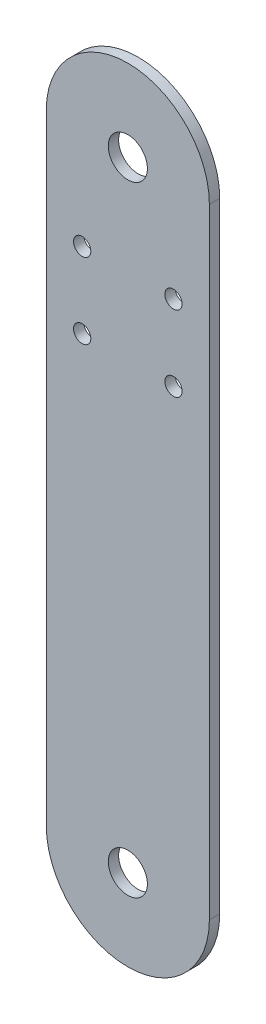
ISO-10303-21;
HEADER;
FILE_DESCRIPTION(('STEP AP214'),'2;1');
FILE_NAME('part.step','',(''),(''),'','','');
FILE_SCHEMA(('AUTOMOTIVE_DESIGN { 1 0 10303 214 1 1 1 1 }'));
ENDSEC;
DATA;
#1=APPLICATION_CONTEXT('core data for automotive mechanical design processes');
#2=APPLICATION_PROTOCOL_DEFINITION('international standard','automotive_design',2000,#1);
#3=PRODUCT_CONTEXT('',#1,'mechanical');
#4=PRODUCT('Part','Part','',(#3));
#5=PRODUCT_RELATED_PRODUCT_CATEGORY('part','',(#4));
#6=PRODUCT_DEFINITION_FORMATION('','',#4);
#7=PRODUCT_DEFINITION_CONTEXT('part definition',#1,'design');
#8=PRODUCT_DEFINITION('design','',#6,#7);
#9=PRODUCT_DEFINITION_SHAPE('','',#8);
#10=(LENGTH_UNIT() NAMED_UNIT(*) SI_UNIT(.MILLI.,.METRE.));
#11=(NAMED_UNIT(*) PLANE_ANGLE_UNIT() SI_UNIT($,.RADIAN.));
#12=(NAMED_UNIT(*) SI_UNIT($,.STERADIAN.) SOLID_ANGLE_UNIT());
#13=UNCERTAINTY_MEASURE_WITH_UNIT(LENGTH_MEASURE(1.E-05),#10,'distance_accuracy_value','');
#14=(GEOMETRIC_REPRESENTATION_CONTEXT(3) GLOBAL_UNCERTAINTY_ASSIGNED_CONTEXT((#13)) GLOBAL_UNIT_ASSIGNED_CONTEXT((#10,
#11,#12)) REPRESENTATION_CONTEXT('',''));
#15=CARTESIAN_POINT('',(0.,0.,0.));
#16=DIRECTION('',(0.,0.,1.));
#17=DIRECTION('',(1.,0.,0.));
#18=AXIS2_PLACEMENT_3D('',#15,#16,#17);
#19=CARTESIAN_POINT('',(0.,0.,-47.275));
#20=DIRECTION('',(0.,0.,1.));
#21=DIRECTION('',(1.,0.,0.));
#22=AXIS2_PLACEMENT_3D('',#19,#20,#21);
#23=CYLINDRICAL_SURFACE('',#22,25.);
#24=CARTESIAN_POINT('',(0.,0.,-44.1));
#25=DIRECTION('',(0.,0.,1.));
#26=DIRECTION('',(1.,0.,0.));
#27=AXIS2_PLACEMENT_3D('',#24,#25,#26);
#28=CIRCLE('',#27,25.);
#29=CARTESIAN_POINT('',(25.,0.,-44.1));
#30=VERTEX_POINT('',#29);
#31=CARTESIAN_POINT('',(-25.,0.,-44.1));
#32=VERTEX_POINT('',#31);
#33=EDGE_CURVE('E104',#30,#32,#28,.T.);
#34=ORIENTED_EDGE('',*,*,#33,.F.);
#35=DIRECTION('',(0.,0.,1.));
#36=VECTOR('',#35,1.);
#37=CARTESIAN_POINT('',(25.,0.,-47.275));
#38=LINE('',#37,#36);
#39=CARTESIAN_POINT('',(25.,0.,-47.275));
#40=VERTEX_POINT('',#39);
#41=EDGE_CURVE('E11',#40,#30,#38,.T.);
#42=ORIENTED_EDGE('',*,*,#41,.F.);
#43=CARTESIAN_POINT('',(0.,0.,-47.275));
#44=DIRECTION('',(0.,0.,1.));
#45=DIRECTION('',(1.,0.,0.));
#46=AXIS2_PLACEMENT_3D('',#43,#44,#45);
#47=CIRCLE('',#46,25.);
#48=CARTESIAN_POINT('',(-25.,0.,-47.275));
#49=VERTEX_POINT('',#48);
#50=EDGE_CURVE('E97',#40,#49,#47,.T.);
#51=ORIENTED_EDGE('',*,*,#50,.T.);
#52=DIRECTION('',(0.,0.,1.));
#53=VECTOR('',#52,1.);
#54=CARTESIAN_POINT('',(-25.,0.,-47.275));
#55=LINE('',#54,#53);
#56=EDGE_CURVE('E42',#49,#32,#55,.T.);
#57=ORIENTED_EDGE('',*,*,#56,.T.);
#58=EDGE_LOOP('',(#34,#42,#51,#57));
#59=FACE_BOUND('',#58,.T.);
#60=ADVANCED_FACE('F39',(#59),#23,.T.);
#61=CARTESIAN_POINT('',(25.,0.,-47.275));
#62=DIRECTION('',(1.,0.,0.));
#63=DIRECTION('',(0.,1.,0.));
#64=AXIS2_PLACEMENT_3D('',#61,#62,#63);
#65=PLANE('',#64);
#66=DIRECTION('',(0.,1.,0.));
#67=VECTOR('',#66,1.);
#68=CARTESIAN_POINT('',(25.,0.,-44.1));
#69=LINE('',#68,#67);
#70=CARTESIAN_POINT('',(25.,-190.,-44.1));
#71=VERTEX_POINT('',#70);
#72=EDGE_CURVE('E99',#71,#30,#69,.T.);
#73=ORIENTED_EDGE('',*,*,#72,.F.);
#74=DIRECTION('',(0.,0.,1.));
#75=VECTOR('',#74,1.);
#76=CARTESIAN_POINT('',(25.,-190.,-47.275));
#77=LINE('',#76,#75);
#78=CARTESIAN_POINT('',(25.,-190.,-47.275));
#79=VERTEX_POINT('',#78);
#80=EDGE_CURVE('E48',#79,#71,#77,.T.);
#81=ORIENTED_EDGE('',*,*,#80,.F.);
#82=DIRECTION('',(0.,1.,0.));
#83=VECTOR('',#82,1.);
#84=CARTESIAN_POINT('',(25.,0.,-47.275));
#85=LINE('',#84,#83);
#86=EDGE_CURVE('E94',#79,#40,#85,.T.);
#87=ORIENTED_EDGE('',*,*,#86,.T.);
#88=ORIENTED_EDGE('',*,*,#41,.T.);
#89=EDGE_LOOP('',(#73,#81,#87,#88));
#90=FACE_BOUND('',#89,.T.);
#91=ADVANCED_FACE('F115',(#90),#65,.T.);
#92=CARTESIAN_POINT('',(0.,-190.,-47.275));
#93=DIRECTION('',(0.,0.,1.));
#94=DIRECTION('',(1.,0.,0.));
#95=AXIS2_PLACEMENT_3D('',#92,#93,#94);
#96=CYLINDRICAL_SURFACE('',#95,25.);
#97=CARTESIAN_POINT('',(0.,-190.,-44.1));
#98=DIRECTION('',(0.,0.,1.));
#99=DIRECTION('',(1.,0.,0.));
#100=AXIS2_PLACEMENT_3D('',#97,#98,#99);
#101=CIRCLE('',#100,25.);
#102=CARTESIAN_POINT('',(-25.,-190.,-44.1));
#103=VERTEX_POINT('',#102);
#104=EDGE_CURVE('E89',#103,#71,#101,.T.);
#105=ORIENTED_EDGE('',*,*,#104,.F.);
#106=DIRECTION('',(0.,0.,1.));
#107=VECTOR('',#106,1.);
#108=CARTESIAN_POINT('',(-25.,-190.,-47.275));
#109=LINE('',#108,#107);
#110=CARTESIAN_POINT('',(-25.,-190.,-47.275));
#111=VERTEX_POINT('',#110);
#112=EDGE_CURVE('E84',#111,#103,#109,.T.);
#113=ORIENTED_EDGE('',*,*,#112,.F.);
#114=CARTESIAN_POINT('',(0.,-190.,-47.275));
#115=DIRECTION('',(0.,0.,1.));
#116=DIRECTION('',(1.,0.,0.));
#117=AXIS2_PLACEMENT_3D('',#114,#115,#116);
#118=CIRCLE('',#117,25.);
#119=EDGE_CURVE('E87',#111,#79,#118,.T.);
#120=ORIENTED_EDGE('',*,*,#119,.T.);
#121=ORIENTED_EDGE('',*,*,#80,.T.);
#122=EDGE_LOOP('',(#105,#113,#120,#121));
#123=FACE_BOUND('',#122,.T.);
#124=ADVANCED_FACE('F86',(#123),#96,.T.);
#125=CARTESIAN_POINT('',(-25.,0.,-47.275));
#126=DIRECTION('',(-1.,0.,0.));
#127=DIRECTION('',(0.,-1.,0.));
#128=AXIS2_PLACEMENT_3D('',#125,#126,#127);
#129=PLANE('',#128);
#130=DIRECTION('',(0.,-1.,0.));
#131=VECTOR('',#130,1.);
#132=CARTESIAN_POINT('',(-25.,0.,-44.1));
#133=LINE('',#132,#131);
#134=EDGE_CURVE('E107',#32,#103,#133,.T.);
#135=ORIENTED_EDGE('',*,*,#134,.F.);
#136=ORIENTED_EDGE('',*,*,#56,.F.);
#137=DIRECTION('',(0.,-1.,0.));
#138=VECTOR('',#137,1.);
#139=CARTESIAN_POINT('',(-25.,0.,-47.275));
#140=LINE('',#139,#138);
#141=EDGE_CURVE('E93',#49,#111,#140,.T.);
#142=ORIENTED_EDGE('',*,*,#141,.T.);
#143=ORIENTED_EDGE('',*,*,#112,.T.);
#144=EDGE_LOOP('',(#135,#136,#142,#143));
#145=FACE_BOUND('',#144,.T.);
#146=ADVANCED_FACE('F96',(#145),#129,.T.);
#147=CARTESIAN_POINT('',(0.,0.,-47.275));
#148=DIRECTION('',(0.,0.,1.));
#149=DIRECTION('',(1.,0.,0.));
#150=AXIS2_PLACEMENT_3D('',#147,#148,#149);
#151=PLANE('',#150);
#152=CARTESIAN_POINT('',(0.,0.,-47.275));
#153=DIRECTION('',(0.,0.,1.));
#154=DIRECTION('',(1.,0.,0.));
#155=AXIS2_PLACEMENT_3D('',#152,#153,#154);
#156=CIRCLE('',#155,6.);
#157=CARTESIAN_POINT('',(6.,0.,-47.275));
#158=VERTEX_POINT('',#157);
#159=EDGE_CURVE('E164',#158,#158,#156,.T.);
#160=ORIENTED_EDGE('',*,*,#159,.T.);
#161=EDGE_LOOP('',(#160));
#162=FACE_BOUND('',#161,.T.);
#163=CARTESIAN_POINT('',(-14.,-30.675,-47.275));
#164=DIRECTION('',(0.,0.,1.));
#165=DIRECTION('',(1.,0.,0.));
#166=AXIS2_PLACEMENT_3D('',#163,#164,#165);
#167=CIRCLE('',#166,2.65);
#168=CARTESIAN_POINT('',(-11.35,-30.675,-47.275));
#169=VERTEX_POINT('',#168);
#170=EDGE_CURVE('E172',#169,#169,#167,.T.);
#171=ORIENTED_EDGE('',*,*,#170,.T.);
#172=EDGE_LOOP('',(#171));
#173=FACE_BOUND('',#172,.T.);
#174=CARTESIAN_POINT('',(14.,-30.675,-47.275));
#175=DIRECTION('',(0.,0.,1.));
#176=DIRECTION('',(1.,0.,0.));
#177=AXIS2_PLACEMENT_3D('',#174,#175,#176);
#178=CIRCLE('',#177,2.65);
#179=CARTESIAN_POINT('',(16.65,-30.675,-47.275));
#180=VERTEX_POINT('',#179);
#181=EDGE_CURVE('E178',#180,#180,#178,.T.);
#182=ORIENTED_EDGE('',*,*,#181,.T.);
#183=EDGE_LOOP('',(#182));
#184=FACE_BOUND('',#183,.T.);
#185=CARTESIAN_POINT('',(14.,-53.85,-47.275));
#186=DIRECTION('',(0.,0.,1.));
#187=DIRECTION('',(1.,0.,0.));
#188=AXIS2_PLACEMENT_3D('',#185,#186,#187);
#189=CIRCLE('',#188,2.65);
#190=CARTESIAN_POINT('',(16.65,-53.85,-47.275));
#191=VERTEX_POINT('',#190);
#192=EDGE_CURVE('E184',#191,#191,#189,.T.);
#193=ORIENTED_EDGE('',*,*,#192,.T.);
#194=EDGE_LOOP('',(#193));
#195=FACE_BOUND('',#194,.T.);
#196=CARTESIAN_POINT('',(-14.,-53.85,-47.275));
#197=DIRECTION('',(0.,0.,1.));
#198=DIRECTION('',(1.,0.,0.));
#199=AXIS2_PLACEMENT_3D('',#196,#197,#198);
#200=CIRCLE('',#199,2.65);
#201=CARTESIAN_POINT('',(-11.35,-53.85,-47.275));
#202=VERTEX_POINT('',#201);
#203=EDGE_CURVE('E190',#202,#202,#200,.T.);
#204=ORIENTED_EDGE('',*,*,#203,.T.);
#205=EDGE_LOOP('',(#204));
#206=FACE_BOUND('',#205,.T.);
#207=CARTESIAN_POINT('',(0.,-190.,-47.275));
#208=DIRECTION('',(0.,0.,1.));
#209=DIRECTION('',(1.,0.,0.));
#210=AXIS2_PLACEMENT_3D('',#207,#208,#209);
#211=CIRCLE('',#210,6.00000000000001);
#212=CARTESIAN_POINT('',(6.00000000000001,-190.,-47.275));
#213=VERTEX_POINT('',#212);
#214=EDGE_CURVE('E108',#213,#213,#211,.T.);
#215=ORIENTED_EDGE('',*,*,#214,.T.);
#216=EDGE_LOOP('',(#215));
#217=FACE_BOUND('',#216,.T.);
#218=ORIENTED_EDGE('',*,*,#50,.F.);
#219=ORIENTED_EDGE('',*,*,#86,.F.);
#220=ORIENTED_EDGE('',*,*,#119,.F.);
#221=ORIENTED_EDGE('',*,*,#141,.F.);
#222=EDGE_LOOP('',(#218,#219,#220,#221));
#223=FACE_BOUND('',#222,.T.);
#224=ADVANCED_FACE('F92',(#162,#173,#184,#195,#206,#217,#223),#151,.F.);
#225=CARTESIAN_POINT('',(0.,0.,-44.1));
#226=DIRECTION('',(0.,0.,1.));
#227=DIRECTION('',(1.,0.,0.));
#228=AXIS2_PLACEMENT_3D('',#225,#226,#227);
#229=PLANE('',#228);
#230=CARTESIAN_POINT('',(0.,0.,-44.1));
#231=DIRECTION('',(0.,0.,1.));
#232=DIRECTION('',(1.,0.,0.));
#233=AXIS2_PLACEMENT_3D('',#230,#231,#232);
#234=CIRCLE('',#233,6.);
#235=CARTESIAN_POINT('',(6.,0.,-44.1));
#236=VERTEX_POINT('',#235);
#237=EDGE_CURVE('E167',#236,#236,#234,.T.);
#238=ORIENTED_EDGE('',*,*,#237,.F.);
#239=EDGE_LOOP('',(#238));
#240=FACE_BOUND('',#239,.T.);
#241=CARTESIAN_POINT('',(-14.,-30.675,-44.1));
#242=DIRECTION('',(0.,0.,1.));
#243=DIRECTION('',(1.,0.,0.));
#244=AXIS2_PLACEMENT_3D('',#241,#242,#243);
#245=CIRCLE('',#244,2.65);
#246=CARTESIAN_POINT('',(-11.35,-30.675,-44.1));
#247=VERTEX_POINT('',#246);
#248=EDGE_CURVE('E169',#247,#247,#245,.T.);
#249=ORIENTED_EDGE('',*,*,#248,.F.);
#250=EDGE_LOOP('',(#249));
#251=FACE_BOUND('',#250,.T.);
#252=CARTESIAN_POINT('',(14.,-30.675,-44.1));
#253=DIRECTION('',(0.,0.,1.));
#254=DIRECTION('',(1.,0.,0.));
#255=AXIS2_PLACEMENT_3D('',#252,#253,#254);
#256=CIRCLE('',#255,2.65);
#257=CARTESIAN_POINT('',(16.65,-30.675,-44.1));
#258=VERTEX_POINT('',#257);
#259=EDGE_CURVE('E175',#258,#258,#256,.T.);
#260=ORIENTED_EDGE('',*,*,#259,.F.);
#261=EDGE_LOOP('',(#260));
#262=FACE_BOUND('',#261,.T.);
#263=CARTESIAN_POINT('',(14.,-53.85,-44.1));
#264=DIRECTION('',(0.,0.,1.));
#265=DIRECTION('',(1.,0.,0.));
#266=AXIS2_PLACEMENT_3D('',#263,#264,#265);
#267=CIRCLE('',#266,2.65);
#268=CARTESIAN_POINT('',(16.65,-53.85,-44.1));
#269=VERTEX_POINT('',#268);
#270=EDGE_CURVE('E181',#269,#269,#267,.T.);
#271=ORIENTED_EDGE('',*,*,#270,.F.);
#272=EDGE_LOOP('',(#271));
#273=FACE_BOUND('',#272,.T.);
#274=CARTESIAN_POINT('',(-14.,-53.85,-44.1));
#275=DIRECTION('',(0.,0.,1.));
#276=DIRECTION('',(1.,0.,0.));
#277=AXIS2_PLACEMENT_3D('',#274,#275,#276);
#278=CIRCLE('',#277,2.65);
#279=CARTESIAN_POINT('',(-11.35,-53.85,-44.1));
#280=VERTEX_POINT('',#279);
#281=EDGE_CURVE('E187',#280,#280,#278,.T.);
#282=ORIENTED_EDGE('',*,*,#281,.F.);
#283=EDGE_LOOP('',(#282));
#284=FACE_BOUND('',#283,.T.);
#285=CARTESIAN_POINT('',(0.,-190.,-44.1));
#286=DIRECTION('',(0.,0.,1.));
#287=DIRECTION('',(1.,0.,0.));
#288=AXIS2_PLACEMENT_3D('',#285,#286,#287);
#289=CIRCLE('',#288,6.00000000000001);
#290=CARTESIAN_POINT('',(6.00000000000001,-190.,-44.1));
#291=VERTEX_POINT('',#290);
#292=EDGE_CURVE('E193',#291,#291,#289,.T.);
#293=ORIENTED_EDGE('',*,*,#292,.F.);
#294=EDGE_LOOP('',(#293));
#295=FACE_BOUND('',#294,.T.);
#296=ORIENTED_EDGE('',*,*,#33,.T.);
#297=ORIENTED_EDGE('',*,*,#134,.T.);
#298=ORIENTED_EDGE('',*,*,#104,.T.);
#299=ORIENTED_EDGE('',*,*,#72,.T.);
#300=EDGE_LOOP('',(#296,#297,#298,#299));
#301=FACE_BOUND('',#300,.T.);
#302=ADVANCED_FACE('F114',(#240,#251,#262,#273,#284,#295,#301),#229,.T.);
#303=CARTESIAN_POINT('',(0.,-190.,-47.275));
#304=DIRECTION('',(0.,0.,1.));
#305=DIRECTION('',(1.,0.,0.));
#306=AXIS2_PLACEMENT_3D('',#303,#304,#305);
#307=CYLINDRICAL_SURFACE('',#306,6.00000000000001);
#308=ORIENTED_EDGE('',*,*,#214,.F.);
#309=EDGE_LOOP('',(#308));
#310=FACE_BOUND('',#309,.T.);
#311=ORIENTED_EDGE('',*,*,#292,.T.);
#312=EDGE_LOOP('',(#311));
#313=FACE_BOUND('',#312,.T.);
#314=ADVANCED_FACE('F133',(#310,#313),#307,.F.);
#315=CARTESIAN_POINT('',(-14.,-53.85,-47.275));
#316=DIRECTION('',(0.,0.,1.));
#317=DIRECTION('',(1.,0.,0.));
#318=AXIS2_PLACEMENT_3D('',#315,#316,#317);
#319=CYLINDRICAL_SURFACE('',#318,2.65);
#320=ORIENTED_EDGE('',*,*,#203,.F.);
#321=EDGE_LOOP('',(#320));
#322=FACE_BOUND('',#321,.T.);
#323=ORIENTED_EDGE('',*,*,#281,.T.);
#324=EDGE_LOOP('',(#323));
#325=FACE_BOUND('',#324,.T.);
#326=ADVANCED_FACE('F140',(#322,#325),#319,.F.);
#327=CARTESIAN_POINT('',(14.,-53.85,-47.275));
#328=DIRECTION('',(0.,0.,1.));
#329=DIRECTION('',(1.,0.,0.));
#330=AXIS2_PLACEMENT_3D('',#327,#328,#329);
#331=CYLINDRICAL_SURFACE('',#330,2.65);
#332=ORIENTED_EDGE('',*,*,#192,.F.);
#333=EDGE_LOOP('',(#332));
#334=FACE_BOUND('',#333,.T.);
#335=ORIENTED_EDGE('',*,*,#270,.T.);
#336=EDGE_LOOP('',(#335));
#337=FACE_BOUND('',#336,.T.);
#338=ADVANCED_FACE('F144',(#334,#337),#331,.F.);
#339=CARTESIAN_POINT('',(14.,-30.675,-47.275));
#340=DIRECTION('',(0.,0.,1.));
#341=DIRECTION('',(1.,0.,0.));
#342=AXIS2_PLACEMENT_3D('',#339,#340,#341);
#343=CYLINDRICAL_SURFACE('',#342,2.65);
#344=ORIENTED_EDGE('',*,*,#181,.F.);
#345=EDGE_LOOP('',(#344));
#346=FACE_BOUND('',#345,.T.);
#347=ORIENTED_EDGE('',*,*,#259,.T.);
#348=EDGE_LOOP('',(#347));
#349=FACE_BOUND('',#348,.T.);
#350=ADVANCED_FACE('F148',(#346,#349),#343,.F.);
#351=CARTESIAN_POINT('',(-14.,-30.675,-47.275));
#352=DIRECTION('',(0.,0.,1.));
#353=DIRECTION('',(1.,0.,0.));
#354=AXIS2_PLACEMENT_3D('',#351,#352,#353);
#355=CYLINDRICAL_SURFACE('',#354,2.65);
#356=ORIENTED_EDGE('',*,*,#170,.F.);
#357=EDGE_LOOP('',(#356));
#358=FACE_BOUND('',#357,.T.);
#359=ORIENTED_EDGE('',*,*,#248,.T.);
#360=EDGE_LOOP('',(#359));
#361=FACE_BOUND('',#360,.T.);
#362=ADVANCED_FACE('F152',(#358,#361),#355,.F.);
#363=CARTESIAN_POINT('',(0.,0.,-47.275));
#364=DIRECTION('',(0.,0.,1.));
#365=DIRECTION('',(1.,0.,0.));
#366=AXIS2_PLACEMENT_3D('',#363,#364,#365);
#367=CYLINDRICAL_SURFACE('',#366,6.);
#368=ORIENTED_EDGE('',*,*,#159,.F.);
#369=EDGE_LOOP('',(#368));
#370=FACE_BOUND('',#369,.T.);
#371=ORIENTED_EDGE('',*,*,#237,.T.);
#372=EDGE_LOOP('',(#371));
#373=FACE_BOUND('',#372,.T.);
#374=ADVANCED_FACE('F156',(#370,#373),#367,.F.);
#375=CLOSED_SHELL('',(#60,#91,#124,#146,#224,#302,#314,#326,#338,#350,#362,#374));
#376=MANIFOLD_SOLID_BREP('B2',#375);
#377=ADVANCED_BREP_SHAPE_REPRESENTATION('',(#18,#376),#14);
#378=SHAPE_DEFINITION_REPRESENTATION(#9,#377);
ENDSEC;
END-ISO-10303-21;
